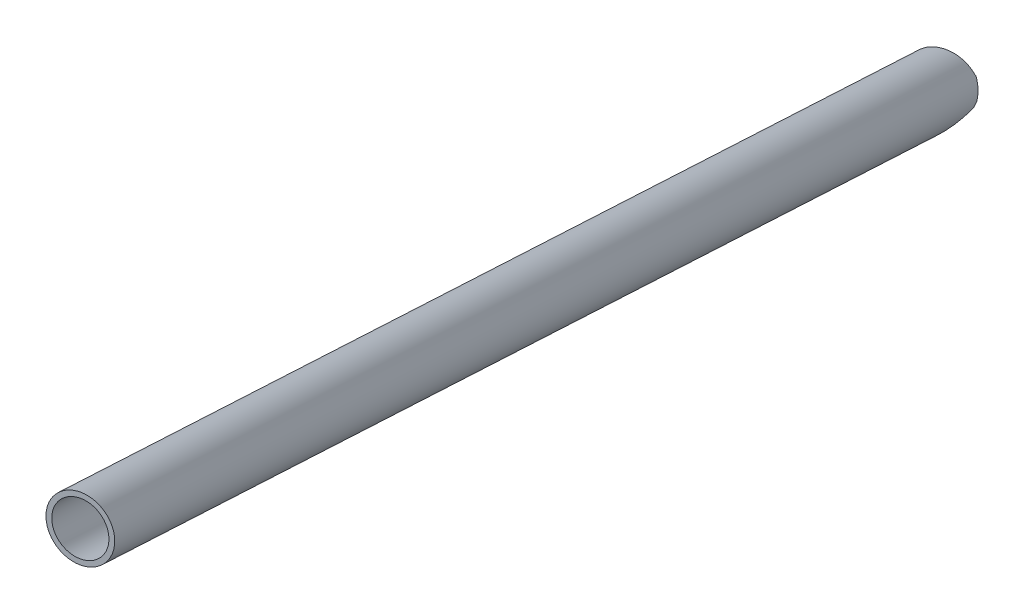
ISO-10303-21;
HEADER;
FILE_DESCRIPTION(('STEP AP214'),'2;1');
FILE_NAME('part.step','',(''),(''),'','','');
FILE_SCHEMA(('AUTOMOTIVE_DESIGN { 1 0 10303 214 1 1 1 1 }'));
ENDSEC;
DATA;
#1=APPLICATION_CONTEXT('core data for automotive mechanical design processes');
#2=APPLICATION_PROTOCOL_DEFINITION('international standard','automotive_design',2000,#1);
#3=PRODUCT_CONTEXT('',#1,'mechanical');
#4=PRODUCT('Part','Part','',(#3));
#5=PRODUCT_RELATED_PRODUCT_CATEGORY('part','',(#4));
#6=PRODUCT_DEFINITION_FORMATION('','',#4);
#7=PRODUCT_DEFINITION_CONTEXT('part definition',#1,'design');
#8=PRODUCT_DEFINITION('design','',#6,#7);
#9=PRODUCT_DEFINITION_SHAPE('','',#8);
#10=(LENGTH_UNIT() NAMED_UNIT(*) SI_UNIT(.MILLI.,.METRE.));
#11=(NAMED_UNIT(*) PLANE_ANGLE_UNIT() SI_UNIT($,.RADIAN.));
#12=(NAMED_UNIT(*) SI_UNIT($,.STERADIAN.) SOLID_ANGLE_UNIT());
#13=UNCERTAINTY_MEASURE_WITH_UNIT(LENGTH_MEASURE(1.E-05),#10,'distance_accuracy_value','');
#14=(GEOMETRIC_REPRESENTATION_CONTEXT(3) GLOBAL_UNCERTAINTY_ASSIGNED_CONTEXT((#13)) GLOBAL_UNIT_ASSIGNED_CONTEXT((#10,
#11,#12)) REPRESENTATION_CONTEXT('',''));
#15=CARTESIAN_POINT('',(0.,0.,0.));
#16=DIRECTION('',(0.,0.,1.));
#17=DIRECTION('',(1.,0.,0.));
#18=AXIS2_PLACEMENT_3D('',#15,#16,#17);
#19=CARTESIAN_POINT('',(-325.,320.,-1580.));
#20=DIRECTION('',(0.327891874330321,0.357700226542168,0.874378331547523));
#21=DIRECTION('',(0.,-0.925546956205677,0.378632845720504));
#22=AXIS2_PLACEMENT_3D('',#19,#20,#21);
#23=CYLINDRICAL_SURFACE('',#22,7.90000000000002);
#24=CARTESIAN_POINT('',(-160.,500.,-1140.));
#25=DIRECTION('',(0.133991346812806,-0.0219122293107185,0.990740214781819));
#26=DIRECTION('',(0.480296136468892,0.8759210569698,-0.0455842434396292));
#27=AXIS2_PLACEMENT_3D('',#24,#25,#26);
#28=ELLIPSE('',#27,8.75464178418664,7.90000000000002);
#29=CARTESIAN_POINT('',(-155.795179374886,507.668375084997,-1140.39907372232));
#30=VERTEX_POINT('',#29);
#31=EDGE_CURVE('E183',#30,#30,#28,.T.);
#32=ORIENTED_EDGE('',*,*,#31,.T.);
#33=EDGE_LOOP('',(#32));
#34=FACE_BOUND('',#33,.T.);
#35=CARTESIAN_POINT('',(-315.333399629659,323.233561268166,-1551.23119953123));
#36=CARTESIAN_POINT('',(-315.405763319512,323.314423066775,-1551.03354222605));
#37=CARTESIAN_POINT('',(-315.484159163716,323.39785916539,-1550.83911750096));
#38=CARTESIAN_POINT('',(-315.656113210453,323.570884481861,-1550.45936086311));
#39=CARTESIAN_POINT('',(-315.749693688439,323.660482626297,-1550.27404283804));
#40=CARTESIAN_POINT('',(-315.956765700975,323.847494334223,-1549.91602971181));
#41=CARTESIAN_POINT('',(-316.070436965258,323.944973727524,-1549.74347038196));
#42=CARTESIAN_POINT('',(-316.321946934806,324.147520192345,-1549.42186258985));
#43=CARTESIAN_POINT('',(-316.459714757017,324.252564491845,-1549.27274754102));
#44=CARTESIAN_POINT('',(-316.707161196136,324.429009425942,-1549.06048030248));
#45=CARTESIAN_POINT('',(-316.808358906311,324.498469593843,-1548.98594016444));
#46=CARTESIAN_POINT('',(-317.021789534646,324.638815964827,-1548.85655824719));
#47=CARTESIAN_POINT('',(-317.134007706629,324.709700164037,-1548.80169059021));
#48=CARTESIAN_POINT('',(-317.368654646138,324.851571761278,-1548.71561072986));
#49=CARTESIAN_POINT('',(-317.491158786939,324.922555340759,-1548.68459382353));
#50=CARTESIAN_POINT('',(-317.741643731065,325.061466879325,-1548.64926453225));
#51=CARTESIAN_POINT('',(-317.869624874466,325.129394648131,-1548.64495380796));
#52=CARTESIAN_POINT('',(-318.114619350582,325.254045017395,-1548.66100850391));
#53=CARTESIAN_POINT('',(-318.231564921933,325.311224199617,-1548.67915248138));
#54=CARTESIAN_POINT('',(-318.463486472579,325.420535890581,-1548.73362317585));
#55=CARTESIAN_POINT('',(-318.578461348553,325.472665643701,-1548.76995975511));
#56=CARTESIAN_POINT('',(-318.881237942308,325.605241313349,-1548.88703941069));
#57=CARTESIAN_POINT('',(-319.065830722992,325.68105840077,-1548.98120205357));
#58=CARTESIAN_POINT('',(-319.422815774065,325.820201003308,-1549.19768963926));
#59=CARTESIAN_POINT('',(-319.595164942511,325.883483667344,-1549.320108194));
#60=CARTESIAN_POINT('',(-319.92557848136,325.99899547335,-1549.58188565249));
#61=CARTESIAN_POINT('',(-320.083820780902,326.051378634092,-1549.72095736124));
#62=CARTESIAN_POINT('',(-320.390479889169,326.14831518555,-1550.01218304978));
#63=CARTESIAN_POINT('',(-320.538886279435,326.19286035414,-1550.16435052098));
#64=CARTESIAN_POINT('',(-320.827483437035,326.275707436931,-1550.47855579089));
#65=CARTESIAN_POINT('',(-320.967652174574,326.313993058298,-1550.64061788592));
#66=CARTESIAN_POINT('',(-321.240474971062,326.385323862255,-1550.97186408443));
#67=CARTESIAN_POINT('',(-321.373132512553,326.418371486429,-1551.14104482288));
#68=CARTESIAN_POINT('',(-321.719963358391,326.501147630622,-1551.60185716009));
#69=CARTESIAN_POINT('',(-321.928285583887,326.546954815725,-1551.89859042742));
#70=CARTESIAN_POINT('',(-322.330299828957,326.629434210481,-1552.50311154898));
#71=CARTESIAN_POINT('',(-322.523983479047,326.666101221435,-1552.81090558096));
#72=CARTESIAN_POINT('',(-322.899404787056,326.732360651881,-1553.43525779152));
#73=CARTESIAN_POINT('',(-323.081117276296,326.761938490684,-1553.75183256381));
#74=CARTESIAN_POINT('',(-323.433864821355,326.815396267659,-1554.39122236583));
#75=CARTESIAN_POINT('',(-323.604902133338,326.83927741284,-1554.71403605796));
#76=CARTESIAN_POINT('',(-323.938074972477,326.88252964466,-1555.36564479495));
#77=CARTESIAN_POINT('',(-324.100184325462,326.901887959129,-1555.69445401786));
#78=CARTESIAN_POINT('',(-324.415929739198,326.936908828802,-1556.35631650357));
#79=CARTESIAN_POINT('',(-324.56956538657,326.952571203825,-1556.68936997244));
#80=CARTESIAN_POINT('',(-324.868872235789,326.980933930636,-1557.35870605283));
#81=CARTESIAN_POINT('',(-325.014552162676,326.993637579314,-1557.6949846312));
#82=CARTESIAN_POINT('',(-325.298603904842,327.016761450983,-1558.37067336597));
#83=CARTESIAN_POINT('',(-325.436975894617,327.027181728515,-1558.71008344738));
#84=CARTESIAN_POINT('',(-325.792198519687,327.052414824422,-1559.60761845466));
#85=CARTESIAN_POINT('',(-326.003236268087,327.065828669234,-1560.16809219843));
#86=CARTESIAN_POINT('',(-326.407265068464,327.090750566266,-1561.2956964921));
#87=CARTESIAN_POINT('',(-326.60025120931,327.102258100507,-1561.86282880659));
#88=CARTESIAN_POINT('',(-326.967426256781,327.126129880023,-1563.00288522148));
#89=CARTESIAN_POINT('',(-327.141623530634,327.138493739889,-1563.57580661849));
#90=CARTESIAN_POINT('',(-327.387276865006,327.160261223046,-1564.43947347269));
#91=CARTESIAN_POINT('',(-327.466546996605,327.168053049991,-1564.72804718638));
#92=CARTESIAN_POINT('',(-327.619396939643,327.185256360705,-1565.30664254928));
#93=CARTESIAN_POINT('',(-327.692976864374,327.194667812214,-1565.59666416954));
#94=CARTESIAN_POINT('',(-327.871179802809,327.221294145624,-1566.33222955315));
#95=CARTESIAN_POINT('',(-327.971596649535,327.240001612747,-1566.77876402495));
#96=CARTESIAN_POINT('',(-328.108648584941,327.274104104047,-1567.45115916422));
#97=CARTESIAN_POINT('',(-328.15208216996,327.286483456225,-1567.67579606142));
#98=CARTESIAN_POINT('',(-328.233773255326,327.313710550404,-1568.12585504461));
#99=CARTESIAN_POINT('',(-328.27203108906,327.328558133281,-1568.35127707906));
#100=CARTESIAN_POINT('',(-328.342510545729,327.361191176228,-1568.80229450371));
#101=CARTESIAN_POINT('',(-328.374746646147,327.378969391367,-1569.02788813386));
#102=CARTESIAN_POINT('',(-328.432298567951,327.418072779137,-1569.47963655836));
#103=CARTESIAN_POINT('',(-328.457615244966,327.439397512693,-1569.70579127984));
#104=CARTESIAN_POINT('',(-328.500044802885,327.486233968978,-1570.15824038692));
#105=CARTESIAN_POINT('',(-328.517165339219,327.511741754594,-1570.38453444373));
#106=CARTESIAN_POINT('',(-328.541629550875,327.567670712397,-1570.83701681505));
#107=CARTESIAN_POINT('',(-328.548975923922,327.598090526235,-1571.0632051415));
#108=CARTESIAN_POINT('',(-328.551699516637,327.660230353109,-1571.48535340525));
#109=CARTESIAN_POINT('',(-328.548514888908,327.691261447946,-1571.68140240643));
#110=CARTESIAN_POINT('',(-328.531660373169,327.75801120749,-1572.07228256964));
#111=CARTESIAN_POINT('',(-328.517990587285,327.793729826536,-1572.26711374351));
#112=CARTESIAN_POINT('',(-328.47840548026,327.870075674565,-1572.65431681872));
#113=CARTESIAN_POINT('',(-328.452507294469,327.910695975834,-1572.84669177568));
#114=CARTESIAN_POINT('',(-328.386591036986,327.996872593437,-1573.22793336252));
#115=CARTESIAN_POINT('',(-328.34657322873,328.042428817669,-1573.41680005777));
#116=CARTESIAN_POINT('',(-328.249872099526,328.138792411352,-1573.79237387545));
#117=CARTESIAN_POINT('',(-328.192929214351,328.189672914507,-1573.97899640072));
#118=CARTESIAN_POINT('',(-328.06124291475,328.294934470016,-1574.34486122777));
#119=CARTESIAN_POINT('',(-327.986500970624,328.34931523296,-1574.52410413772));
#120=CARTESIAN_POINT('',(-327.818687821829,328.45974431726,-1574.87311010974));
#121=CARTESIAN_POINT('',(-327.725629690268,328.515791425186,-1575.04287982298));
#122=CARTESIAN_POINT('',(-327.521555835006,328.627269470309,-1575.37146979602));
#123=CARTESIAN_POINT('',(-327.410541473639,328.68270045391,-1575.5302908852));
#124=CARTESIAN_POINT('',(-327.190252511787,328.782122046344,-1575.81251662485));
#125=CARTESIAN_POINT('',(-327.083332542087,328.826561649206,-1575.93761306396));
#126=CARTESIAN_POINT('',(-326.85875414873,328.911693558091,-1576.17910497236));
#127=CARTESIAN_POINT('',(-326.741096909995,328.95238627661,-1576.29550139916));
#128=CARTESIAN_POINT('',(-326.496238028299,329.028725861985,-1576.51980955621));
#129=CARTESIAN_POINT('',(-326.369027466978,329.06436792199,-1576.62771316076));
#130=CARTESIAN_POINT('',(-326.106514438379,329.129422264453,-1576.83523054674));
#131=CARTESIAN_POINT('',(-325.971211406032,329.158834111226,-1576.93484374811));
#132=CARTESIAN_POINT('',(-325.687452428767,329.211681243505,-1577.13059902464));
#133=CARTESIAN_POINT('',(-325.538677696422,329.234778688036,-1577.22636965114));
#134=CARTESIAN_POINT('',(-325.235165370716,329.272285728207,-1577.40979672161));
#135=CARTESIAN_POINT('',(-325.080427744105,329.286695275394,-1577.49745312033));
#136=CARTESIAN_POINT('',(-324.766309000478,329.306184068903,-1577.66514578508));
#137=CARTESIAN_POINT('',(-324.606927802231,329.311263151905,-1577.7451819177));
#138=CARTESIAN_POINT('',(-324.284738369201,329.311618078678,-1577.89807129706));
#139=CARTESIAN_POINT('',(-324.121929793476,329.30689294256,-1577.97092382507));
#140=CARTESIAN_POINT('',(-323.767901020709,329.285742230177,-1578.12087043292));
#141=CARTESIAN_POINT('',(-323.576285511866,329.267573050976,-1578.1967921385));
#142=CARTESIAN_POINT('',(-323.191621766305,329.217292917934,-1578.3399058341));
#143=CARTESIAN_POINT('',(-322.998573403534,329.185180722846,-1578.4070970462));
#144=CARTESIAN_POINT('',(-322.612499613271,329.106878815367,-1578.53308135697));
#145=CARTESIAN_POINT('',(-322.419474227996,329.060683308554,-1578.59187098425));
#146=CARTESIAN_POINT('',(-322.034963616786,328.954270171164,-1578.70121117565));
#147=CARTESIAN_POINT('',(-321.84347841052,328.894052361805,-1578.75176163472));
#148=CARTESIAN_POINT('',(-321.451604111266,328.755632359435,-1578.84759674596));
#149=CARTESIAN_POINT('',(-321.251398983903,328.676546656217,-1578.89236065075));
#150=CARTESIAN_POINT('',(-320.855757760964,328.50321098709,-1578.97269051317));
#151=CARTESIAN_POINT('',(-320.660321889079,328.408960311468,-1579.00825604012));
#152=CARTESIAN_POINT('',(-320.275633045782,328.205895636922,-1579.07007347317));
#153=CARTESIAN_POINT('',(-320.086380242329,328.097081242789,-1579.09632512646));
#154=CARTESIAN_POINT('',(-319.715372967075,327.865664931246,-1579.13929697637));
#155=CARTESIAN_POINT('',(-319.533618449636,327.743063097769,-1579.15601723102));
#156=CARTESIAN_POINT('',(-319.177140847466,327.483804275216,-1579.17971932613));
#157=CARTESIAN_POINT('',(-319.002499253677,327.347026749228,-1579.18660878792));
#158=CARTESIAN_POINT('',(-318.66316588564,327.06151831497,-1579.18991654466));
#159=CARTESIAN_POINT('',(-318.498474270792,326.912787215289,-1579.18633467189));
#160=CARTESIAN_POINT('',(-318.179944311894,326.604635423269,-1579.16813424789));
#161=CARTESIAN_POINT('',(-318.02611003923,326.445210764209,-1579.15351158027));
#162=CARTESIAN_POINT('',(-317.730174734067,326.117240926517,-1579.11252099005));
#163=CARTESIAN_POINT('',(-317.588073505158,325.948695900639,-1579.08615326412));
#164=CARTESIAN_POINT('',(-317.316837398707,325.604975414902,-1579.02095034229));
#165=CARTESIAN_POINT('',(-317.187648737174,325.429832034551,-1578.98216995382));
#166=CARTESIAN_POINT('',(-316.941980227584,325.074196409678,-1578.89107751168));
#167=CARTESIAN_POINT('',(-316.825501237967,324.893703804905,-1578.8387645448));
#168=CARTESIAN_POINT('',(-316.60558925693,324.529830623412,-1578.71945732421));
#169=CARTESIAN_POINT('',(-316.502146602617,324.346452300439,-1578.65247404659));
#170=CARTESIAN_POINT('',(-316.308223054267,323.979406084608,-1578.50248701489));
#171=CARTESIAN_POINT('',(-316.217738777726,323.795738280016,-1578.41948745485));
#172=CARTESIAN_POINT('',(-316.067365370185,323.470146213186,-1578.25570613337));
#173=CARTESIAN_POINT('',(-316.005065778693,323.327668557713,-1578.1782222683));
#174=CARTESIAN_POINT('',(-315.887995482559,323.046253253456,-1578.01198069397));
#175=CARTESIAN_POINT('',(-315.833223193704,322.90731486482,-1577.92322536452));
#176=CARTESIAN_POINT('',(-315.730827989233,322.635035870966,-1577.73421614502));
#177=CARTESIAN_POINT('',(-315.683194738186,322.501687378674,-1577.63397925577));
#178=CARTESIAN_POINT('',(-315.594380548157,322.242276612676,-1577.4218692965));
#179=CARTESIAN_POINT('',(-315.553199599395,322.116214327929,-1577.3099962441));
#180=CARTESIAN_POINT('',(-315.476425025566,321.872760198212,-1577.07463252502));
#181=CARTESIAN_POINT('',(-315.440849663771,321.75539732821,-1576.95110589809));
#182=CARTESIAN_POINT('',(-315.374592255223,321.531238942449,-1576.69361096771));
#183=CARTESIAN_POINT('',(-315.343910039858,321.424443062612,-1576.55964302429));
#184=CARTESIAN_POINT('',(-315.286538589595,321.222318485603,-1576.28250144945));
#185=CARTESIAN_POINT('',(-315.259850000899,321.126991644703,-1576.13932633358));
#186=CARTESIAN_POINT('',(-315.209611806546,320.948115463389,-1575.84525758833));
#187=CARTESIAN_POINT('',(-315.186063147395,320.864569673839,-1575.69436165045));
#188=CARTESIAN_POINT('',(-315.133333316466,320.68118022122,-1575.33121929594));
#189=CARTESIAN_POINT('',(-315.105156233176,320.586218929981,-1575.11635897397));
#190=CARTESIAN_POINT('',(-315.05169444828,320.41585042387,-1574.67869269755));
#191=CARTESIAN_POINT('',(-315.026411166113,320.340452782391,-1574.4558829135));
#192=CARTESIAN_POINT('',(-314.977648848196,320.206514839213,-1574.00424761842));
#193=CARTESIAN_POINT('',(-314.954176666142,320.148036470312,-1573.77540327019));
#194=CARTESIAN_POINT('',(-314.908516135877,320.045746527074,-1573.31444837575));
#195=CARTESIAN_POINT('',(-314.886327546509,320.001932190258,-1573.08233845333));
#196=CARTESIAN_POINT('',(-314.832498778552,319.908616973112,-1572.50489773418));
#197=CARTESIAN_POINT('',(-314.801396993228,319.866367260962,-1572.15835619142));
#198=CARTESIAN_POINT('',(-314.740710249794,319.802493173618,-1571.46317632494));
#199=CARTESIAN_POINT('',(-314.711126238371,319.780881526571,-1571.11453684054));
#200=CARTESIAN_POINT('',(-314.653421208916,319.753775532386,-1570.41579289268));
#201=CARTESIAN_POINT('',(-314.625303519492,319.748316410316,-1570.06568689239));
#202=CARTESIAN_POINT('',(-314.570789775219,319.750315425514,-1569.36549310476));
#203=CARTESIAN_POINT('',(-314.544393338282,319.757770685828,-1569.01540533072));
#204=CARTESIAN_POINT('',(-314.493438445317,319.783284688288,-1568.31340737935));
#205=CARTESIAN_POINT('',(-314.468891840751,319.801406164255,-1567.961498732));
#206=CARTESIAN_POINT('',(-314.422131080797,319.846540505099,-1567.2580936522));
#207=CARTESIAN_POINT('',(-314.399917027014,319.873553757082,-1566.90659723836));
#208=CARTESIAN_POINT('',(-314.358194113681,319.935143979947,-1566.20458598498));
#209=CARTESIAN_POINT('',(-314.33868169721,319.969710848183,-1565.85407046174));
#210=CARTESIAN_POINT('',(-314.302688168187,320.045493926285,-1565.15360127801));
#211=CARTESIAN_POINT('',(-314.2862071134,320.086710262836,-1564.80364762835));
#212=CARTESIAN_POINT('',(-314.253465976667,320.184658327785,-1564.02878431281));
#213=CARTESIAN_POINT('',(-314.238023389674,320.242818133684,-1563.60402015081));
#214=CARTESIAN_POINT('',(-314.212937420518,320.367112706315,-1562.75548065498));
#215=CARTESIAN_POINT('',(-314.203294175754,320.433247661953,-1562.3317053448));
#216=CARTESIAN_POINT('',(-314.190654065486,320.573041989535,-1561.48492420418));
#217=CARTESIAN_POINT('',(-314.18766286581,320.64670771995,-1561.06191933609));
#218=CARTESIAN_POINT('',(-314.189345873673,320.801270539699,-1560.21725339972));
#219=CARTESIAN_POINT('',(-314.194019879008,320.882167438226,-1559.79559229629));
#220=CARTESIAN_POINT('',(-314.21221137968,321.050821242316,-1558.95575804294));
#221=CARTESIAN_POINT('',(-314.225689842674,321.138546371691,-1558.53757771016));
#222=CARTESIAN_POINT('',(-314.262965480171,321.321413370269,-1557.70324416263));
#223=CARTESIAN_POINT('',(-314.286763611767,321.416555926726,-1557.28709113952));
#224=CARTESIAN_POINT('',(-314.346620854514,321.614654647886,-1556.45799316404));
#225=CARTESIAN_POINT('',(-314.382666633972,321.717602222485,-1556.04504522072));
#226=CARTESIAN_POINT('',(-314.469666481701,321.932226575263,-1555.22304912915));
#227=CARTESIAN_POINT('',(-314.520616701958,322.043901094882,-1554.81400000242));
#228=CARTESIAN_POINT('',(-314.621509190658,322.239138544288,-1554.13448649421));
#229=CARTESIAN_POINT('',(-314.6663261739,322.319943222987,-1553.8624713739));
#230=CARTESIAN_POINT('',(-314.766086109023,322.48673434242,-1553.3217873964));
#231=CARTESIAN_POINT('',(-314.821031793648,322.572722177357,-1553.05311946322));
#232=CARTESIAN_POINT('',(-314.943043123523,322.75039597602,-1552.5212447947));
#233=CARTESIAN_POINT('',(-315.010076231458,322.842066219214,-1552.258025463));
#234=CARTESIAN_POINT('',(-315.159301976276,323.032296634775,-1551.73853508196));
#235=CARTESIAN_POINT('',(-315.24148480192,323.130852322493,-1551.48225965812));
#236=CARTESIAN_POINT('',(-315.333399629659,323.233561268166,-1551.23119953123));
#237=B_SPLINE_CURVE_WITH_KNOTS('',3,(#35,#36,#37,#38,#39,#40,#41,#42,#43,#44,#45,#46,#47,#48,
#49,#50,#51,#52,#53,#54,#55,#56,#57,#58,#59,#60,#61,#62,#63,#64,#65,#66,#67,#68,#69,#70,#71,#72,
#73,#74,#75,#76,#77,#78,#79,#80,#81,#82,#83,#84,#85,#86,#87,#88,#89,#90,#91,#92,#93,#94,#95,#96,
#97,#98,#99,#100,#101,#102,#103,#104,#105,#106,#107,#108,#109,#110,#111,#112,#113,#114,#115,
#116,#117,#118,#119,#120,#121,#122,#123,#124,#125,#126,#127,#128,#129,#130,#131,#132,#133,#134,
#135,#136,#137,#138,#139,#140,#141,#142,#143,#144,#145,#146,#147,#148,#149,#150,#151,#152,#153,
#154,#155,#156,#157,#158,#159,#160,#161,#162,#163,#164,#165,#166,#167,#168,#169,#170,#171,#172,
#173,#174,#175,#176,#177,#178,#179,#180,#181,#182,#183,#184,#185,#186,#187,#188,#189,#190,#191,
#192,#193,#194,#195,#196,#197,#198,#199,#200,#201,#202,#203,#204,#205,#206,#207,#208,#209,#210,
#211,#212,#213,#214,#215,#216,#217,#218,#219,#220,#221,#222,#223,#224,#225,#226,#227,#228,#229,
#230,#231,#232,#233,#234,#235,#236),.UNSPECIFIED.,.T.,.F.,(4,2,2,2,2,2,2,2,2,2,2,2,2,2,2,2,2,2,
2,2,2,2,2,2,2,2,2,2,2,2,2,2,2,2,2,2,2,2,2,2,2,2,2,2,2,2,2,2,2,2,2,2,2,2,2,2,2,2,2,2,2,2,2,2,2,2,
2,2,2,2,2,2,2,2,2,2,2,2,2,2,2,2,2,2,2,2,2,2,2,2,2,2,2,2,2,2,2,2,2,2,4),(0.,0.676315255867582,
1.35363176996711,2.03734620802291,2.71908223935392,3.14845139331011,3.57725365179962,
4.0095307457752,4.44183471957563,4.8345889241461,5.2275562727554,5.8856889238719,
6.54603408797718,7.19629670152455,7.84723743191138,8.49984639845851,9.15215026465882,
10.2476309746095,11.3437333515389,12.442071159474,13.5401760456477,14.6413454042071,
15.7425684343567,16.8425584441045,17.9425221770393,19.7392828393565,21.5365309163296,
23.3329752928072,24.2310160832863,25.1290389888585,26.5028304232723,27.1901701132745,
27.8774655083382,28.563086616564,29.2486229050238,29.9335176274805,30.6182232758568,
31.2134870482124,31.8087450227033,32.4031713413832,32.9975865701829,33.6016346207576,
34.2056327909486,34.8092014129405,35.4127242638458,35.923495657058,36.4342107516973,
36.9454086895216,37.4566423641877,37.9914330336249,38.5262266855299,39.0610296983509,
39.5958861650137,40.2159258659967,40.8360207760255,41.4563711623111,42.0767294584044,
42.7355473547701,43.3943960924153,44.0532627124861,44.7121253218528,45.3771393001152,
46.0421639292597,46.707436624941,47.3726981817179,48.0350619216868,48.697470371576,
49.3593849014946,50.0211263367895,50.541823420297,51.0624107482448,51.5822369685638,
52.1020624010763,52.6235479114222,53.1450154480874,53.666567271382,54.1882759583403,
54.8968695660993,55.605809270139,56.3173121253497,57.0286808687661,58.0792664489359,
59.1304995407659,60.1840234548675,61.2373127043135,62.2968597129153,63.3564528552991,
64.4146374164128,65.4728421401548,66.7597379422668,68.0466642327842,69.3346862337064,
70.6226742578384,71.9049907131506,73.1874261216102,74.4684700340775,75.749183499475,
76.6108330775924,77.4727154717753,78.3323115469639,79.1913528750938),.UNSPECIFIED.);
#238=CARTESIAN_POINT('',(-314.51800675531,319.770985762675,-1568.65187457882));
#239=VERTEX_POINT('',#238);
#240=CARTESIAN_POINT('',(-325.871823061559,329.17723130927,-1577.00323914385));
#241=VERTEX_POINT('',#240);
#242=EDGE_CURVE('E135',#239,#241,#237,.T.);
#243=ORIENTED_EDGE('',*,*,#242,.T.);
#244=CARTESIAN_POINT('',(-318.639741179462,319.626643213835,-1560.04811033071));
#245=CARTESIAN_POINT('',(-318.74711356477,319.63918835473,-1560.0174452549));
#246=CARTESIAN_POINT('',(-318.855881597741,319.652250715959,-1559.99185884114));
#247=CARTESIAN_POINT('',(-319.075183206708,319.67927551611,-1559.95085304417));
#248=CARTESIAN_POINT('',(-319.185716922683,319.693238026663,-1559.93543447116));
#249=CARTESIAN_POINT('',(-319.51871921443,319.736293983194,-1559.9040710208));
#250=CARTESIAN_POINT('',(-319.742544276507,319.766550618484,-1559.90303081285));
#251=CARTESIAN_POINT('',(-320.247815714025,319.83757821605,-1559.94052244572));
#252=CARTESIAN_POINT('',(-320.528272722445,319.8789610069,-1559.9899588769));
#253=CARTESIAN_POINT('',(-321.077426362502,319.963420168994,-1560.13290948077));
#254=CARTESIAN_POINT('',(-321.346096655463,320.006499961769,-1560.22651737119));
#255=CARTESIAN_POINT('',(-321.825678150977,320.086287808822,-1560.4284812054));
#256=CARTESIAN_POINT('',(-322.038786936291,320.122869761726,-1560.53182859002));
#257=CARTESIAN_POINT('',(-322.455185192632,320.196465001959,-1560.7567545216));
#258=CARTESIAN_POINT('',(-322.658467501857,320.23347858019,-1560.87834610823));
#259=CARTESIAN_POINT('',(-323.055827467165,320.307919026404,-1561.13623279716));
#260=CARTESIAN_POINT('',(-323.249888229983,320.34534650893,-1561.27255349219));
#261=CARTESIAN_POINT('',(-323.629123562789,320.420600507852,-1561.55701695356));
#262=CARTESIAN_POINT('',(-323.814294665783,320.458427173027,-1561.70516427328));
#263=CARTESIAN_POINT('',(-324.17767411705,320.534843222793,-1562.01230599832));
#264=CARTESIAN_POINT('',(-324.355819211697,320.573436212237,-1562.17137396865));
#265=CARTESIAN_POINT('',(-324.704229632077,320.651233345387,-1562.49770006142));
#266=CARTESIAN_POINT('',(-324.874495929499,320.690437412927,-1562.66495716863));
#267=CARTESIAN_POINT('',(-325.207865882158,320.769670756066,-1563.00659524478));
#268=CARTESIAN_POINT('',(-325.370962095605,320.809700828493,-1563.18098326879));
#269=CARTESIAN_POINT('',(-325.690255058808,320.890753013835,-1563.53573540341));
#270=CARTESIAN_POINT('',(-325.846451647542,320.931775149868,-1563.71609965333));
#271=CARTESIAN_POINT('',(-326.152682282426,321.015156895198,-1564.08246080284));
#272=CARTESIAN_POINT('',(-326.302700054224,321.057519574122,-1564.26847058296));
#273=CARTESIAN_POINT('',(-326.596445731904,321.143777059319,-1564.64504735071));
#274=CARTESIAN_POINT('',(-326.740173460022,321.187671908829,-1564.83561446691));
#275=CARTESIAN_POINT('',(-327.02145551773,321.277314010278,-1565.22065163588));
#276=CARTESIAN_POINT('',(-327.159013300363,321.323060198131,-1565.41511941516));
#277=CARTESIAN_POINT('',(-327.428146993837,321.41684743498,-1565.80759555445));
#278=CARTESIAN_POINT('',(-327.559723024631,321.464888437917,-1566.00560384337));
#279=CARTESIAN_POINT('',(-327.895393641849,321.593928865477,-1566.52653480478));
#280=CARTESIAN_POINT('',(-328.094759732715,321.677155303843,-1566.851969244));
#281=CARTESIAN_POINT('',(-328.477651818016,321.853640098818,-1567.50961255392));
#282=CARTESIAN_POINT('',(-328.661171645905,321.946902329408,-1567.84182400026));
#283=CARTESIAN_POINT('',(-328.922936536971,322.097145484141,-1568.34333919007));
#284=CARTESIAN_POINT('',(-329.007814817918,322.148861152333,-1568.51077532989));
#285=CARTESIAN_POINT('',(-329.172815383208,322.256444731748,-1568.84664635664));
#286=CARTESIAN_POINT('',(-329.252938130242,322.31231223782,-1569.01508114464));
#287=CARTESIAN_POINT('',(-329.407886010267,322.428935781506,-1569.35255228847));
#288=CARTESIAN_POINT('',(-329.482714720047,322.489688458118,-1569.52158815552));
#289=CARTESIAN_POINT('',(-329.62643526677,322.617028772352,-1569.85996510067));
#290=CARTESIAN_POINT('',(-329.695328264487,322.683615263967,-1570.02930611246));
#291=CARTESIAN_POINT('',(-329.821115134444,322.818204260142,-1570.35450621914));
#292=CARTESIAN_POINT('',(-329.87852644959,322.885684807915,-1570.51037959592));
#293=CARTESIAN_POINT('',(-329.986562467933,323.027463125957,-1570.82141344875));
#294=CARTESIAN_POINT('',(-330.037187026506,323.101761041445,-1570.97657390954));
#295=CARTESIAN_POINT('',(-330.130368421211,323.258074714635,-1571.28526273382));
#296=CARTESIAN_POINT('',(-330.172932918168,323.340083031746,-1571.43879251484));
#297=CARTESIAN_POINT('',(-330.24852961921,323.512774276037,-1571.74332804561));
#298=CARTESIAN_POINT('',(-330.281563589518,323.603455591761,-1571.89433425815));
#299=CARTESIAN_POINT('',(-330.331992501111,323.778965524418,-1572.16882135925));
#300=CARTESIAN_POINT('',(-330.351038143068,323.862435661768,-1572.29286426607));
#301=CARTESIAN_POINT('',(-330.380041121285,324.036015626333,-1572.53730013876));
#302=CARTESIAN_POINT('',(-330.390001035983,324.126123561958,-1572.65769413078));
#303=CARTESIAN_POINT('',(-330.399807485127,324.312571636274,-1572.8937500467));
#304=CARTESIAN_POINT('',(-330.399667582319,324.408903243593,-1573.00941810794));
#305=CARTESIAN_POINT('',(-330.388501340698,324.607158601097,-1573.23532370563));
#306=CARTESIAN_POINT('',(-330.377475131132,324.709082284877,-1573.34556130654));
#307=CARTESIAN_POINT('',(-330.344030208816,324.917611377275,-1573.56022574307));
#308=CARTESIAN_POINT('',(-330.321583954184,325.024227532278,-1573.66463785056));
#309=CARTESIAN_POINT('',(-330.265215091994,325.240451606446,-1573.86705669305));
#310=CARTESIAN_POINT('',(-330.231292244299,325.350059588168,-1573.96506329396));
#311=CARTESIAN_POINT('',(-330.152193211694,325.570897711677,-1574.15489791263));
#312=CARTESIAN_POINT('',(-330.10699719558,325.682130383411,-1574.24671467606));
#313=CARTESIAN_POINT('',(-330.005932681387,325.904538502825,-1574.42436612073));
#314=CARTESIAN_POINT('',(-329.950061433502,326.015713928345,-1574.51019925287));
#315=CARTESIAN_POINT('',(-329.812553780942,326.265304509705,-1574.6980115788));
#316=CARTESIAN_POINT('',(-329.727993333316,326.403305273605,-1574.79840389508));
#317=CARTESIAN_POINT('',(-329.544551775052,326.674797123952,-1574.99193430179));
#318=CARTESIAN_POINT('',(-329.445666767097,326.808286970875,-1575.08507040736));
#319=CARTESIAN_POINT('',(-329.23495064079,327.069064044552,-1575.26549148302));
#320=CARTESIAN_POINT('',(-329.123108269287,327.1963457413,-1575.35277126158));
#321=CARTESIAN_POINT('',(-328.887893866675,327.443143106567,-1575.522577114));
#322=CARTESIAN_POINT('',(-328.764522557617,327.562659260645,-1575.60510348502));
#323=CARTESIAN_POINT('',(-328.504757529711,327.795188078769,-1575.76809787743));
#324=CARTESIAN_POINT('',(-328.368144901392,327.90801168968,-1575.84848638805));
#325=CARTESIAN_POINT('',(-328.085344253884,328.123321780457,-1576.006188751));
#326=CARTESIAN_POINT('',(-327.939156223696,328.225808248448,-1576.0835025998));
#327=CARTESIAN_POINT('',(-327.638353854478,328.419528640881,-1576.23566713456));
#328=CARTESIAN_POINT('',(-327.483741746663,328.510765524218,-1576.31051846441));
#329=CARTESIAN_POINT('',(-327.167125909131,328.681243652952,-1576.45822791543));
#330=CARTESIAN_POINT('',(-327.005121874109,328.760484402294,-1576.53108595407));
#331=CARTESIAN_POINT('',(-326.650676994837,328.916924732921,-1576.68560897389));
#332=CARTESIAN_POINT('',(-326.457241888067,328.992142838089,-1576.76700951285));
#333=CARTESIAN_POINT('',(-326.063624322021,329.125070721158,-1576.9278137233));
#334=CARTESIAN_POINT('',(-325.863441253543,329.182778913541,-1577.00721721336));
#335=CARTESIAN_POINT('',(-325.457888143414,329.279998457347,-1577.1640761223));
#336=CARTESIAN_POINT('',(-325.25251674846,329.319505008333,-1577.24153102218));
#337=CARTESIAN_POINT('',(-324.838275805739,329.379781260037,-1577.39433738643));
#338=CARTESIAN_POINT('',(-324.629406380576,329.400551616051,-1577.46968892428));
#339=CARTESIAN_POINT('',(-324.211969752486,329.422924334597,-1577.61725707177));
#340=CARTESIAN_POINT('',(-324.00342161165,329.424721998973,-1577.68949798348));
#341=CARTESIAN_POINT('',(-323.586089439792,329.409549505489,-1577.83128341677));
#342=CARTESIAN_POINT('',(-323.377305408715,329.392579343142,-1577.90082793772));
#343=CARTESIAN_POINT('',(-322.961096816164,329.339975996952,-1578.03673533536));
#344=CARTESIAN_POINT('',(-322.753672034124,329.304345921017,-1578.10309873989));
#345=CARTESIAN_POINT('',(-322.341649940434,329.214731259672,-1578.23209535939));
#346=CARTESIAN_POINT('',(-322.137052596923,329.160746881268,-1578.29472861643));
#347=CARTESIAN_POINT('',(-321.735756308523,329.036065348007,-1578.4145320986));
#348=CARTESIAN_POINT('',(-321.538981464743,328.965687125911,-1578.47178047028));
#349=CARTESIAN_POINT('',(-321.15076300462,328.808373674742,-1578.58137656894));
#350=CARTESIAN_POINT('',(-320.959319329499,328.721438628295,-1578.63372434996));
#351=CARTESIAN_POINT('',(-320.582842304188,328.531801929297,-1578.73276119694));
#352=CARTESIAN_POINT('',(-320.397810180947,328.429097279191,-1578.77944918402));
#353=CARTESIAN_POINT('',(-320.03517309636,328.208884197289,-1578.86628744068));
#354=CARTESIAN_POINT('',(-319.857568198606,328.091375638779,-1578.9064376543));
#355=CARTESIAN_POINT('',(-319.507448639049,327.840362686404,-1578.97987260346));
#356=CARTESIAN_POINT('',(-319.33508618303,327.706605349047,-1579.01301855961));
#357=CARTESIAN_POINT('',(-318.999634376083,327.426131581598,-1579.07028238742));
#358=CARTESIAN_POINT('',(-318.836545680477,327.279414237568,-1579.09439962175));
#359=CARTESIAN_POINT('',(-318.520178366508,326.9744355072,-1579.13215428036));
#360=CARTESIAN_POINT('',(-318.366901807924,326.816171711837,-1579.14578951082));
#361=CARTESIAN_POINT('',(-318.070611764098,326.489780680746,-1579.16082119993));
#362=CARTESIAN_POINT('',(-317.927596448408,326.321655213963,-1579.16221984682));
#363=CARTESIAN_POINT('',(-317.676618401612,326.008151357641,-1579.15169816444));
#364=CARTESIAN_POINT('',(-317.566949764898,325.864055919184,-1579.1421060398));
#365=CARTESIAN_POINT('',(-317.35477410495,325.571816571987,-1579.11185631514));
#366=CARTESIAN_POINT('',(-317.252265806647,325.423673390614,-1579.09120069095));
#367=CARTESIAN_POINT('',(-317.054559384469,325.125114325366,-1579.03734068803));
#368=CARTESIAN_POINT('',(-316.959350456563,324.974702210819,-1579.00415530394));
#369=CARTESIAN_POINT('',(-316.776047075519,324.673317739362,-1578.92364291975));
#370=CARTESIAN_POINT('',(-316.687950942186,324.522345523625,-1578.87631927191));
#371=CARTESIAN_POINT('',(-316.534950305352,324.250844347752,-1578.77662031201));
#372=CARTESIAN_POINT('',(-316.468830597668,324.130009805942,-1578.72693752413));
#373=CARTESIAN_POINT('',(-316.341121412516,323.89089053404,-1578.61681084513));
#374=CARTESIAN_POINT('',(-316.27953084424,323.772605194875,-1578.55636955719));
#375=CARTESIAN_POINT('',(-316.160841587066,323.540157741833,-1578.42454317277));
#376=CARTESIAN_POINT('',(-316.103737500144,323.425990765195,-1578.35317154222));
#377=CARTESIAN_POINT('',(-315.993798840084,323.203006585145,-1578.19959347977));
#378=CARTESIAN_POINT('',(-315.940964290128,323.094189410782,-1578.11738698904));
#379=CARTESIAN_POINT('',(-315.839406394226,322.883107915282,-1577.94279854597));
#380=CARTESIAN_POINT('',(-315.790680920246,322.780840208952,-1577.85042191848));
#381=CARTESIAN_POINT('',(-315.697076739269,322.58356801399,-1577.65644913853));
#382=CARTESIAN_POINT('',(-315.652198079369,322.488563614285,-1577.55485287322));
#383=CARTESIAN_POINT('',(-315.565976362056,322.306075231623,-1577.34355925816));
#384=CARTESIAN_POINT('',(-315.524636704757,322.218598480482,-1577.23385430234));
#385=CARTESIAN_POINT('',(-315.445246496008,322.051191200789,-1577.00768238747));
#386=CARTESIAN_POINT('',(-315.407197106091,321.971263336243,-1576.89121306452));
#387=CARTESIAN_POINT('',(-315.310639446357,321.769612807106,-1576.5761476059));
#388=CARTESIAN_POINT('',(-315.254683614143,321.654010801706,-1576.37284108384));
#389=CARTESIAN_POINT('',(-315.149820169104,321.439795940929,-1575.9557306222));
#390=CARTESIAN_POINT('',(-315.100917985851,321.341196161784,-1575.74191876403));
#391=CARTESIAN_POINT('',(-315.009190585747,321.15782265481,-1575.30607535985));
#392=CARTESIAN_POINT('',(-314.966393861488,321.07311349299,-1575.08401100442));
#393=CARTESIAN_POINT('',(-314.886615645277,320.915528031003,-1574.63482033353));
#394=CARTESIAN_POINT('',(-314.849632861718,320.842649102553,-1574.40769515521));
#395=CARTESIAN_POINT('',(-314.776681692683,320.697689049844,-1573.91991166475));
#396=CARTESIAN_POINT('',(-314.741474862082,320.626951977479,-1573.65874370855));
#397=CARTESIAN_POINT('',(-314.677856833988,320.495415719318,-1573.13306531477));
#398=CARTESIAN_POINT('',(-314.649447344564,320.434619032603,-1572.8685540546));
#399=CARTESIAN_POINT('',(-314.59941373104,320.321099277794,-1572.3368772753));
#400=CARTESIAN_POINT('',(-314.577797093792,320.268385150553,-1572.06970915999));
#401=CARTESIAN_POINT('',(-314.541561165489,320.16973715941,-1571.53368507137));
#402=CARTESIAN_POINT('',(-314.52694128489,320.123802724482,-1571.26482924219));
#403=CARTESIAN_POINT('',(-314.505024400203,320.03775852608,-1570.72643423293));
#404=CARTESIAN_POINT('',(-314.49771311196,319.997637532441,-1570.45689742206));
#405=CARTESIAN_POINT('',(-314.490798462366,319.922342737256,-1569.91703298125));
#406=CARTESIAN_POINT('',(-314.491195150566,319.887168967516,-1569.64670534623));
#407=CARTESIAN_POINT('',(-314.500262617981,319.821227527228,-1569.10589647373));
#408=CARTESIAN_POINT('',(-314.508925906331,319.790455896664,-1568.83541559684));
#409=CARTESIAN_POINT('',(-314.535235649432,319.732867912615,-1568.2944506107));
#410=CARTESIAN_POINT('',(-314.552882495155,319.706051731341,-1568.02396650182));
#411=CARTESIAN_POINT('',(-314.598137447942,319.656006544075,-1567.48251334257));
#412=CARTESIAN_POINT('',(-314.62578069261,319.632790609554,-1567.21154597908));
#413=CARTESIAN_POINT('',(-314.692142686861,319.589896499991,-1566.67071575341));
#414=CARTESIAN_POINT('',(-314.730859696742,319.570217770039,-1566.4008527245));
#415=CARTESIAN_POINT('',(-314.82092179262,319.534279333177,-1565.86210813843));
#416=CARTESIAN_POINT('',(-314.872306271457,319.518030591041,-1565.59323235032));
#417=CARTESIAN_POINT('',(-314.989420563177,319.489087544957,-1565.05841667021));
#418=CARTESIAN_POINT('',(-315.05514901006,319.476392902809,-1564.79247650118));
#419=CARTESIAN_POINT('',(-315.204468867193,319.454552309756,-1564.26052841877));
#420=CARTESIAN_POINT('',(-315.288346332088,319.445470706998,-1563.99459700514));
#421=CARTESIAN_POINT('',(-315.476324575498,319.431515256012,-1563.46954677123));
#422=CARTESIAN_POINT('',(-315.580438817294,319.426644220839,-1563.21043261741));
#423=CARTESIAN_POINT('',(-315.811818868881,319.421681909537,-1562.70455274409));
#424=CARTESIAN_POINT('',(-315.938930800346,319.42155996438,-1562.45771807638));
#425=CARTESIAN_POINT('',(-316.220820910471,319.426773912764,-1561.98070453335));
#426=CARTESIAN_POINT('',(-316.375542740186,319.432098792723,-1561.75049305138));
#427=CARTESIAN_POINT('',(-316.690462684525,319.447807194585,-1561.34887977529));
#428=CARTESIAN_POINT('',(-316.846079816037,319.457276818755,-1561.17389684213));
#429=CARTESIAN_POINT('',(-317.181549115791,319.481324739868,-1560.84929351491));
#430=CARTESIAN_POINT('',(-317.361369663047,319.495896410273,-1560.69964059445));
#431=CARTESIAN_POINT('',(-317.718886976709,319.528164005805,-1560.45180355756));
#432=CARTESIAN_POINT('',(-317.893694431908,319.545188036617,-1560.34942362276));
#433=CARTESIAN_POINT('',(-318.166407091647,319.573632969501,-1560.2187466956));
#434=CARTESIAN_POINT('',(-318.259091901848,319.583602968288,-1560.17899445051));
#435=CARTESIAN_POINT('',(-318.447387757388,319.604456593761,-1560.10749211584));
#436=CARTESIAN_POINT('',(-318.542997966212,319.615339960794,-1560.07573976223));
#437=CARTESIAN_POINT('',(-318.639741179462,319.626643213835,-1560.04811033071));
#438=B_SPLINE_CURVE_WITH_KNOTS('',3,(#244,#245,#246,#247,#248,#249,#250,#251,#252,#253,#254,
#255,#256,#257,#258,#259,#260,#261,#262,#263,#264,#265,#266,#267,#268,#269,#270,#271,#272,#273,
#274,#275,#276,#277,#278,#279,#280,#281,#282,#283,#284,#285,#286,#287,#288,#289,#290,#291,#292,
#293,#294,#295,#296,#297,#298,#299,#300,#301,#302,#303,#304,#305,#306,#307,#308,#309,#310,#311,
#312,#313,#314,#315,#316,#317,#318,#319,#320,#321,#322,#323,#324,#325,#326,#327,#328,#329,#330,
#331,#332,#333,#334,#335,#336,#337,#338,#339,#340,#341,#342,#343,#344,#345,#346,#347,#348,#349,
#350,#351,#352,#353,#354,#355,#356,#357,#358,#359,#360,#361,#362,#363,#364,#365,#366,#367,#368,
#369,#370,#371,#372,#373,#374,#375,#376,#377,#378,#379,#380,#381,#382,#383,#384,#385,#386,#387,
#388,#389,#390,#391,#392,#393,#394,#395,#396,#397,#398,#399,#400,#401,#402,#403,#404,#405,#406,
#407,#408,#409,#410,#411,#412,#413,#414,#415,#416,#417,#418,#419,#420,#421,#422,#423,#424,#425,
#426,#427,#428,#429,#430,#431,#432,#433,#434,#435,#436,#437),.UNSPECIFIED.,.T.,.F.,(4,2,2,2,2,2,
2,2,2,2,2,2,2,2,2,2,2,2,2,2,2,2,2,2,2,2,2,2,2,2,2,2,2,2,2,2,2,2,2,2,2,2,2,2,2,2,2,2,2,2,2,2,2,2,
2,2,2,2,2,2,2,2,2,2,2,2,2,2,2,2,2,2,2,2,2,2,2,2,2,2,2,2,2,2,2,2,2,2,2,2,2,2,2,2,2,2,4),(0.,
0.336984435995778,0.673995720760301,1.34815613966058,2.20676367497261,3.06720114902719,
3.78516449655328,4.50364346021156,5.22339153721544,5.94341807498151,6.6688903737752,
7.39427296070044,8.120391452971,8.84652688230453,9.5744663274449,10.3024263316911,
11.0299737118614,11.7575064958221,12.9288786962358,14.100704698807,14.6847643972626,
15.2687671757887,15.8523715423427,16.4358615203605,16.9735240848304,17.5111981049206,
18.04835848972,18.5854192624983,19.0371681677413,19.4887888312443,19.9398030379686,
20.3908118900894,20.8429136392703,21.2950248488346,21.7479370698352,22.2009661130261,
22.7715044291569,23.3421982656236,23.9133915044869,24.4845489937343,25.0676895474579,
25.6508307710947,26.2338182868046,26.8168299031902,27.4848307599052,28.1528920858735,
28.8211295031995,29.4893435480513,30.1506723126418,30.8120012353352,31.4732200451929,
32.1344313978935,32.7837192633651,33.4329999674933,34.0824042429286,34.7318140772849,
35.393084362149,36.0544013170736,36.7158566444349,37.3771936834683,37.9207228932437,
38.4641550667422,39.0067667046358,39.5492497887613,39.9880894693432,40.4268231103143,
40.86502052584,41.3032203204387,41.7411917656376,42.1791685721403,42.6175615520249,
43.0561086674305,43.7762717370644,44.4969862297797,45.2209611835604,45.9447750734462,
46.7630025517192,47.5814354226681,48.4007672043069,49.2200299373176,50.0376883272023,
50.8553519735369,51.6722753884109,52.4892343595363,53.3090933291434,54.1288235686192,
54.95113586372,55.7733698828889,56.6096545012229,57.4464974057794,58.2779351816924,
59.1076950920821,59.8086100130863,60.5086179422868,61.1156638535992,61.4193750575292,
61.7230002127277),.UNSPECIFIED.);
#439=CARTESIAN_POINT('',(-318.092458031597,326.511255002311,-1579.15823816235));
#440=VERTEX_POINT('',#439);
#441=EDGE_CURVE('E128',#241,#440,#438,.T.);
#442=ORIENTED_EDGE('',*,*,#441,.T.);
#443=CARTESIAN_POINT('',(-315.766769727686,322.730410387243,-1577.80019333513));
#444=VERTEX_POINT('',#443);
#445=EDGE_CURVE('E143',#440,#444,#237,.T.);
#446=ORIENTED_EDGE('',*,*,#445,.T.);
#447=EDGE_CURVE('E123',#444,#239,#438,.T.);
#448=ORIENTED_EDGE('',*,*,#447,.T.);
#449=EDGE_LOOP('',(#243,#442,#446,#448));
#450=FACE_BOUND('',#449,.T.);
#451=ADVANCED_FACE('F41',(#34,#450),#23,.F.);
#452=CARTESIAN_POINT('',(-325.,320.,-1580.));
#453=DIRECTION('',(0.327891874330321,0.357700226542168,0.874378331547523));
#454=DIRECTION('',(0.,-0.925546956205677,0.378632845720504));
#455=AXIS2_PLACEMENT_3D('',#452,#453,#454);
#456=CYLINDRICAL_SURFACE('',#455,9.49999999999999);
#457=CARTESIAN_POINT('',(-160.,500.,-1140.));
#458=DIRECTION('',(0.133991346812806,-0.0219122293107185,0.990740214781819));
#459=DIRECTION('',(0.480296136468892,0.8759210569698,-0.0455842434396292));
#460=AXIS2_PLACEMENT_3D('',#457,#458,#459);
#461=ELLIPSE('',#460,10.5277337911105,9.49999999999999);
#462=CARTESIAN_POINT('',(-154.943570134357,509.221463709806,-1140.47989878));
#463=VERTEX_POINT('',#462);
#464=EDGE_CURVE('E144',#463,#463,#461,.T.);
#465=ORIENTED_EDGE('',*,*,#464,.F.);
#466=EDGE_LOOP('',(#465));
#467=FACE_BOUND('',#466,.T.);
#468=CARTESIAN_POINT('',(-325.,320.,-1580.));
#469=DIRECTION('',(0.575900421927711,-0.591430314898986,0.5644013524452));
#470=DIRECTION('',(0.0643470418800076,0.721033704278357,0.689905685942596));
#471=AXIS2_PLACEMENT_3D('',#468,#469,#470);
#472=ELLIPSE('',#471,20.1793359239418,9.49999999999999);
#473=CARTESIAN_POINT('',(-317.150459822562,325.575629614009,-1582.16682174211));
#474=VERTEX_POINT('',#473);
#475=CARTESIAN_POINT('',(-317.153209222855,325.364017391339,-1582.3857625759));
#476=VERTEX_POINT('',#475);
#477=EDGE_CURVE('E110',#474,#476,#472,.F.);
#478=ORIENTED_EDGE('',*,*,#477,.F.);
#479=CARTESIAN_POINT('',(-325.,320.,-1580.));
#480=DIRECTION('',(0.305167903675072,-0.0602810391674664,0.950388734615185));
#481=DIRECTION('',(0.121099921390839,0.992348751359358,0.0240575292716185));
#482=AXIS2_PLACEMENT_3D('',#479,#480,#481);
#483=ELLIPSE('',#482,10.4453128150917,9.49999999999999);
#484=CARTESIAN_POINT('',(-332.865550179852,324.792328907583,-1577.17042097799));
#485=VERTEX_POINT('',#484);
#486=EDGE_CURVE('E124',#485,#474,#483,.F.);
#487=ORIENTED_EDGE('',*,*,#486,.F.);
#488=CARTESIAN_POINT('',(-325.,320.,-1580.));
#489=DIRECTION('',(0.44960962563742,0.866344599612376,-0.217481537737459));
#490=DIRECTION('',(0.215613645815456,0.131014802823684,0.967649666552538));
#491=AXIS2_PLACEMENT_3D('',#488,#489,#490);
#492=ELLIPSE('',#491,35.5600329351407,9.49999999999999);
#493=CARTESIAN_POINT('',(-314.067977258352,318.283768053476,-1564.23638893929));
#494=VERTEX_POINT('',#493);
#495=EDGE_CURVE('E122',#494,#485,#492,.F.);
#496=ORIENTED_EDGE('',*,*,#495,.F.);
#497=CARTESIAN_POINT('',(-325.,320.,-1580.));
#498=DIRECTION('',(0.121099921390839,0.992348751359358,0.0240575292716185));
#499=DIRECTION('',(0.305167903675072,-0.0602810391674664,0.950388734615185));
#500=AXIS2_PLACEMENT_3D('',#497,#498,#499);
#501=ELLIPSE('',#500,22.852665209327,9.49999999999999);
#502=CARTESIAN_POINT('',(-315.081075048708,318.781102535936,-1579.65123830792));
#503=VERTEX_POINT('',#502);
#504=EDGE_CURVE('E64',#503,#494,#501,.F.);
#505=ORIENTED_EDGE('',*,*,#504,.F.);
#506=CARTESIAN_POINT('',(-325.,320.,-1580.));
#507=DIRECTION('',(0.0643470418800076,0.721033704278357,0.689905685942596));
#508=DIRECTION('',(0.575900421927711,-0.591430314898986,0.5644013524452));
#509=AXIS2_PLACEMENT_3D('',#506,#507,#508);
#510=ELLIPSE('',#509,10.7679061529634,9.49999999999999);
#511=CARTESIAN_POINT('',(-315.218180579702,319.895480340688,-1580.80310824808));
#512=VERTEX_POINT('',#511);
#513=EDGE_CURVE('E102',#512,#503,#510,.F.);
#514=ORIENTED_EDGE('',*,*,#513,.F.);
#515=CARTESIAN_POINT('',(-325.,320.,-1580.));
#516=DIRECTION('',(0.0811881304601258,0.303486431394752,0.949370566971437));
#517=DIRECTION('',(0.955324029155695,0.247897826893776,-0.16094305433622));
#518=AXIS2_PLACEMENT_3D('',#515,#516,#517);
#519=ELLIPSE('',#518,9.84163110462987,9.49999999999999);
#520=EDGE_CURVE('E178',#476,#512,#519,.F.);
#521=ORIENTED_EDGE('',*,*,#520,.F.);
#522=EDGE_LOOP('',(#478,#487,#496,#505,#514,#521));
#523=FACE_BOUND('',#522,.T.);
#524=ADVANCED_FACE('F119',(#467,#523),#456,.T.);
#525=CARTESIAN_POINT('',(-325.,320.000000000001,-1580.));
#526=DIRECTION('',(0.171152156864514,-0.228202875819352,-0.958452078441276));
#527=DIRECTION('',(0.,0.972806214685367,-0.23162052730604));
#528=AXIS2_PLACEMENT_3D('',#525,#526,#527);
#529=CYLINDRICAL_SURFACE('',#528,9.49999999999999);
#530=CARTESIAN_POINT('',(-325.,320.,-1580.));
#531=DIRECTION('',(0.492848464858469,-0.860535216309269,-0.128761532214443));
#532=DIRECTION('',(-0.0306416701609081,0.130725495483689,-0.990944969652853));
#533=AXIS2_PLACEMENT_3D('',#530,#531,#532);
#534=ELLIPSE('',#533,23.5066795946768,9.49999999999999);
#535=CARTESIAN_POINT('',(-316.749201071944,324.717084971533,-1579.94427024051));
#536=VERTEX_POINT('',#535);
#537=CARTESIAN_POINT('',(-316.850455147292,324.957595377925,-1581.93920293328));
#538=VERTEX_POINT('',#537);
#539=EDGE_CURVE('E56',#536,#538,#534,.F.);
#540=ORIENTED_EDGE('',*,*,#539,.T.);
#541=CARTESIAN_POINT('',(-325.,320.000000000001,-1580.));
#542=DIRECTION('',(0.217268286027578,-0.644059979147453,-0.733472041148959));
#543=DIRECTION('',(-0.046806891515563,0.743683273485426,-0.666891523146495));
#544=AXIS2_PLACEMENT_3D('',#541,#542,#543);
#545=ELLIPSE('',#544,10.7083267615423,9.49999999999999);
#546=EDGE_CURVE('E11',#538,#476,#545,.F.);
#547=ORIENTED_EDGE('',*,*,#546,.T.);
#548=ORIENTED_EDGE('',*,*,#520,.T.);
#549=CARTESIAN_POINT('',(-325.,320.000000000001,-1580.));
#550=DIRECTION('',(-0.046806891515563,0.743683273485426,-0.666891523146495));
#551=DIRECTION('',(0.217268286027578,-0.644059979147453,-0.733472041148959));
#552=AXIS2_PLACEMENT_3D('',#549,#550,#551);
#553=ELLIPSE('',#552,20.5867526008063,9.49999999999999);
#554=CARTESIAN_POINT('',(-315.341374922451,320.385714809065,-1580.24777727505));
#555=VERTEX_POINT('',#554);
#556=EDGE_CURVE('E49',#512,#555,#553,.F.);
#557=ORIENTED_EDGE('',*,*,#556,.T.);
#558=CARTESIAN_POINT('',(-325.,320.,-1580.));
#559=DIRECTION('',(-0.0306416701609081,0.130725495483689,-0.990944969652853));
#560=DIRECTION('',(0.492848464858469,-0.860535216309269,-0.128761532214443));
#561=AXIS2_PLACEMENT_3D('',#558,#559,#560);
#562=ELLIPSE('',#561,10.3859535817137,9.49999999999999);
#563=CARTESIAN_POINT('',(-316.098290941936,323.36649192335,-1579.83114794765));
#564=VERTEX_POINT('',#563);
#565=EDGE_CURVE('E114',#555,#564,#562,.F.);
#566=ORIENTED_EDGE('',*,*,#565,.T.);
#567=CARTESIAN_POINT('',(-325.,320.,-1580.));
#568=DIRECTION('',(0.0427126536783039,-0.062929792122569,-0.997103540500769));
#569=DIRECTION('',(-0.611440895819702,0.787641342485715,-0.0759022168747456));
#570=AXIS2_PLACEMENT_3D('',#567,#568,#569);
#571=ELLIPSE('',#570,9.72019067100084,9.49999999999999);
#572=EDGE_CURVE('E109',#536,#564,#571,.T.);
#573=ORIENTED_EDGE('',*,*,#572,.F.);
#574=EDGE_LOOP('',(#540,#547,#548,#557,#566,#573));
#575=FACE_BOUND('',#574,.T.);
#576=ADVANCED_FACE('F152',(#575),#529,.F.);
#577=CARTESIAN_POINT('',(-225.,200.,-450.));
#578=DIRECTION('',(-0.0876619818920292,0.105194378270435,-0.99058039537993));
#579=DIRECTION('',(0.,0.994408591727349,0.105600912395825));
#580=AXIS2_PLACEMENT_3D('',#577,#578,#579);
#581=CYLINDRICAL_SURFACE('',#580,9.49999999999999);
#582=ORIENTED_EDGE('',*,*,#572,.T.);
#583=CARTESIAN_POINT('',(-325.,320.,-1580.));
#584=DIRECTION('',(0.339265481067858,-0.880480026315422,-0.331140237083004));
#585=DIRECTION('',(-0.160873788386029,0.292525943468637,-0.942628344899574));
#586=AXIS2_PLACEMENT_3D('',#583,#584,#585);
#587=ELLIPSE('',#586,46.19301628238,9.49999999999999);
#588=EDGE_CURVE('E171',#564,#444,#587,.T.);
#589=ORIENTED_EDGE('',*,*,#588,.T.);
#590=ORIENTED_EDGE('',*,*,#445,.F.);
#591=CARTESIAN_POINT('',(-325.,320.,-1580.));
#592=DIRECTION('',(-0.160873788386029,0.292525943468637,-0.942628344899574));
#593=DIRECTION('',(0.339265481067858,-0.880480026315422,-0.331140237083004));
#594=AXIS2_PLACEMENT_3D('',#591,#592,#593);
#595=ELLIPSE('',#594,9.70751008020208,9.49999999999999);
#596=EDGE_CURVE('E173',#440,#536,#595,.T.);
#597=ORIENTED_EDGE('',*,*,#596,.T.);
#598=EDGE_LOOP('',(#582,#589,#590,#597));
#599=FACE_BOUND('',#598,.T.);
#600=ADVANCED_FACE('F147',(#599),#581,.F.);
#601=ORIENTED_EDGE('',*,*,#242,.F.);
#602=EDGE_CURVE('E177',#239,#494,#587,.T.);
#603=ORIENTED_EDGE('',*,*,#602,.T.);
#604=ORIENTED_EDGE('',*,*,#495,.T.);
#605=EDGE_CURVE('E174',#485,#241,#595,.T.);
#606=ORIENTED_EDGE('',*,*,#605,.T.);
#607=EDGE_LOOP('',(#601,#603,#604,#606));
#608=FACE_BOUND('',#607,.T.);
#609=ADVANCED_FACE('F151',(#608),#581,.F.);
#610=CARTESIAN_POINT('',(-160.,500.,-1140.));
#611=DIRECTION('',(0.133991346812806,-0.0219122293107185,0.990740214781819));
#612=DIRECTION('',(0.990978150341289,0.,-0.134023526092089));
#613=AXIS2_PLACEMENT_3D('',#610,#611,#612);
#614=PLANE('',#613);
#615=ORIENTED_EDGE('',*,*,#31,.F.);
#616=EDGE_LOOP('',(#615));
#617=FACE_BOUND('',#616,.T.);
#618=ORIENTED_EDGE('',*,*,#464,.T.);
#619=EDGE_LOOP('',(#618));
#620=FACE_BOUND('',#619,.T.);
#621=ADVANCED_FACE('F43',(#617,#620),#614,.T.);
#622=CARTESIAN_POINT('',(-325.,320.000000000001,-1580.));
#623=DIRECTION('',(0.227207840964845,-0.4673512982197,0.85437659205789));
#624=DIRECTION('',(0.,-0.877321812102288,-0.479902529696977));
#625=AXIS2_PLACEMENT_3D('',#622,#623,#624);
#626=CYLINDRICAL_SURFACE('',#625,9.49999999999999);
#627=ORIENTED_EDGE('',*,*,#486,.T.);
#628=CARTESIAN_POINT('',(-325.,320.,-1580.));
#629=DIRECTION('',(0.0100583123703579,0.349879267870479,0.936740801004567));
#630=DIRECTION('',(-0.287052887423582,0.898369431045867,-0.332465043552115));
#631=AXIS2_PLACEMENT_3D('',#628,#629,#630);
#632=ELLIPSE('',#631,14.8646950385778,9.49999999999999);
#633=EDGE_CURVE('E115',#538,#474,#632,.T.);
#634=ORIENTED_EDGE('',*,*,#633,.F.);
#635=ORIENTED_EDGE('',*,*,#539,.F.);
#636=ORIENTED_EDGE('',*,*,#596,.F.);
#637=ORIENTED_EDGE('',*,*,#441,.F.);
#638=ORIENTED_EDGE('',*,*,#605,.F.);
#639=EDGE_LOOP('',(#627,#634,#635,#636,#637,#638));
#640=FACE_BOUND('',#639,.T.);
#641=ADVANCED_FACE('F162',(#640),#626,.F.);
#642=CARTESIAN_POINT('',(-250.,0.,-1700.));
#643=DIRECTION('',(-0.214351342090107,0.914565726251124,0.342962147344171));
#644=DIRECTION('',(0.,-0.351123441588391,0.936329177569045));
#645=AXIS2_PLACEMENT_3D('',#642,#643,#644);
#646=CYLINDRICAL_SURFACE('',#645,9.49999999999999);
#647=ORIENTED_EDGE('',*,*,#477,.T.);
#648=ORIENTED_EDGE('',*,*,#546,.F.);
#649=ORIENTED_EDGE('',*,*,#633,.T.);
#650=EDGE_LOOP('',(#647,#648,#649));
#651=FACE_BOUND('',#650,.T.);
#652=ADVANCED_FACE('F159',(#651),#646,.F.);
#653=ORIENTED_EDGE('',*,*,#513,.T.);
#654=EDGE_CURVE('E104',#503,#555,#632,.T.);
#655=ORIENTED_EDGE('',*,*,#654,.T.);
#656=ORIENTED_EDGE('',*,*,#556,.F.);
#657=EDGE_LOOP('',(#653,#655,#656));
#658=FACE_BOUND('',#657,.T.);
#659=ADVANCED_FACE('F103',(#658),#646,.F.);
#660=ORIENTED_EDGE('',*,*,#654,.F.);
#661=ORIENTED_EDGE('',*,*,#504,.T.);
#662=ORIENTED_EDGE('',*,*,#602,.F.);
#663=ORIENTED_EDGE('',*,*,#447,.F.);
#664=ORIENTED_EDGE('',*,*,#588,.F.);
#665=ORIENTED_EDGE('',*,*,#565,.F.);
#666=EDGE_LOOP('',(#660,#661,#662,#663,#664,#665));
#667=FACE_BOUND('',#666,.T.);
#668=ADVANCED_FACE('F112',(#667),#626,.F.);
#669=CLOSED_SHELL('',(#451,#524,#576,#600,#609,#621,#641,#652,#659,#668));
#670=MANIFOLD_SOLID_BREP('B2',#669);
#671=ADVANCED_BREP_SHAPE_REPRESENTATION('',(#18,#670),#14);
#672=SHAPE_DEFINITION_REPRESENTATION(#9,#671);
ENDSEC;
END-ISO-10303-21;
